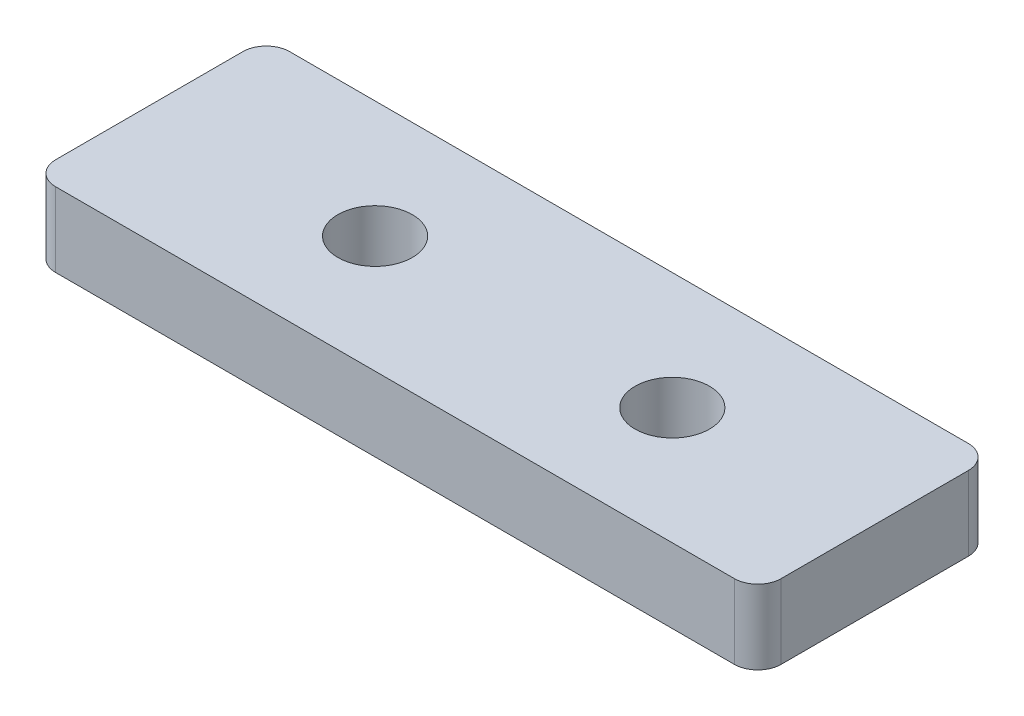
ISO-10303-21;
HEADER;
FILE_DESCRIPTION(('STEP AP214'),'2;1');
FILE_NAME('part.step','',(''),(''),'','','');
FILE_SCHEMA(('AUTOMOTIVE_DESIGN { 1 0 10303 214 1 1 1 1 }'));
ENDSEC;
DATA;
#1=APPLICATION_CONTEXT('core data for automotive mechanical design processes');
#2=APPLICATION_PROTOCOL_DEFINITION('international standard','automotive_design',2000,#1);
#3=PRODUCT_CONTEXT('',#1,'mechanical');
#4=PRODUCT('Part','Part','',(#3));
#5=PRODUCT_RELATED_PRODUCT_CATEGORY('part','',(#4));
#6=PRODUCT_DEFINITION_FORMATION('','',#4);
#7=PRODUCT_DEFINITION_CONTEXT('part definition',#1,'design');
#8=PRODUCT_DEFINITION('design','',#6,#7);
#9=PRODUCT_DEFINITION_SHAPE('','',#8);
#10=(LENGTH_UNIT() NAMED_UNIT(*) SI_UNIT(.MILLI.,.METRE.));
#11=(NAMED_UNIT(*) PLANE_ANGLE_UNIT() SI_UNIT($,.RADIAN.));
#12=(NAMED_UNIT(*) SI_UNIT($,.STERADIAN.) SOLID_ANGLE_UNIT());
#13=UNCERTAINTY_MEASURE_WITH_UNIT(LENGTH_MEASURE(1.E-05),#10,'distance_accuracy_value','');
#14=(GEOMETRIC_REPRESENTATION_CONTEXT(3) GLOBAL_UNCERTAINTY_ASSIGNED_CONTEXT((#13)) GLOBAL_UNIT_ASSIGNED_CONTEXT((#10,
#11,#12)) REPRESENTATION_CONTEXT('',''));
#15=CARTESIAN_POINT('',(0.,0.,0.));
#16=DIRECTION('',(0.,0.,1.));
#17=DIRECTION('',(1.,0.,0.));
#18=AXIS2_PLACEMENT_3D('',#15,#16,#17);
#19=CARTESIAN_POINT('',(0.,3.175,5.));
#20=DIRECTION('',(0.,0.,-1.));
#21=DIRECTION('',(-1.,0.,0.));
#22=AXIS2_PLACEMENT_3D('',#19,#20,#21);
#23=PLANE('',#22);
#24=DIRECTION('',(1.,0.,0.));
#25=VECTOR('',#24,1.);
#26=CARTESIAN_POINT('',(0.,0.,5.));
#27=LINE('',#26,#25);
#28=CARTESIAN_POINT('',(-8.65,0.,5.));
#29=VERTEX_POINT('',#28);
#30=CARTESIAN_POINT('',(20.35,0.,5.));
#31=VERTEX_POINT('',#30);
#32=EDGE_CURVE('E134',#29,#31,#27,.T.);
#33=ORIENTED_EDGE('',*,*,#32,.T.);
#34=DIRECTION('',(0.,-1.,0.));
#35=VECTOR('',#34,1.);
#36=CARTESIAN_POINT('',(20.35,3.175,5.));
#37=LINE('',#36,#35);
#38=CARTESIAN_POINT('',(20.35,3.175,5.));
#39=VERTEX_POINT('',#38);
#40=EDGE_CURVE('E162',#31,#39,#37,.F.);
#41=ORIENTED_EDGE('',*,*,#40,.T.);
#42=DIRECTION('',(1.,0.,0.));
#43=VECTOR('',#42,1.);
#44=CARTESIAN_POINT('',(0.,3.175,5.));
#45=LINE('',#44,#43);
#46=CARTESIAN_POINT('',(-8.65,3.175,5.));
#47=VERTEX_POINT('',#46);
#48=EDGE_CURVE('E212',#47,#39,#45,.T.);
#49=ORIENTED_EDGE('',*,*,#48,.F.);
#50=DIRECTION('',(0.,-1.,0.));
#51=VECTOR('',#50,1.);
#52=CARTESIAN_POINT('',(-8.65,3.175,5.));
#53=LINE('',#52,#51);
#54=EDGE_CURVE('E158',#47,#29,#53,.T.);
#55=ORIENTED_EDGE('',*,*,#54,.T.);
#56=EDGE_LOOP('',(#33,#41,#49,#55));
#57=FACE_BOUND('',#56,.T.);
#58=ADVANCED_FACE('F45',(#57),#23,.F.);
#59=CARTESIAN_POINT('',(21.35,3.175,0.));
#60=DIRECTION('',(1.,0.,0.));
#61=DIRECTION('',(0.,0.,-1.));
#62=AXIS2_PLACEMENT_3D('',#59,#60,#61);
#63=PLANE('',#62);
#64=DIRECTION('',(0.,0.,1.));
#65=VECTOR('',#64,1.);
#66=CARTESIAN_POINT('',(21.35,3.175,0.));
#67=LINE('',#66,#65);
#68=CARTESIAN_POINT('',(21.35,3.175,-4.));
#69=VERTEX_POINT('',#68);
#70=CARTESIAN_POINT('',(21.35,3.175,4.));
#71=VERTEX_POINT('',#70);
#72=EDGE_CURVE('E209',#69,#71,#67,.T.);
#73=ORIENTED_EDGE('',*,*,#72,.T.);
#74=DIRECTION('',(0.,-1.,0.));
#75=VECTOR('',#74,1.);
#76=CARTESIAN_POINT('',(21.35,0.,4.));
#77=LINE('',#76,#75);
#78=CARTESIAN_POINT('',(21.35,0.,4.));
#79=VERTEX_POINT('',#78);
#80=EDGE_CURVE('E132',#71,#79,#77,.T.);
#81=ORIENTED_EDGE('',*,*,#80,.T.);
#82=DIRECTION('',(0.,0.,1.));
#83=VECTOR('',#82,1.);
#84=CARTESIAN_POINT('',(21.35,0.,0.));
#85=LINE('',#84,#83);
#86=CARTESIAN_POINT('',(21.35,0.,-4.));
#87=VERTEX_POINT('',#86);
#88=EDGE_CURVE('E114',#87,#79,#85,.T.);
#89=ORIENTED_EDGE('',*,*,#88,.F.);
#90=DIRECTION('',(0.,-1.,0.));
#91=VECTOR('',#90,1.);
#92=CARTESIAN_POINT('',(21.35,3.175,-4.));
#93=LINE('',#92,#91);
#94=EDGE_CURVE('E129',#87,#69,#93,.F.);
#95=ORIENTED_EDGE('',*,*,#94,.T.);
#96=EDGE_LOOP('',(#73,#81,#89,#95));
#97=FACE_BOUND('',#96,.T.);
#98=ADVANCED_FACE('F128',(#97),#63,.T.);
#99=CARTESIAN_POINT('',(0.,3.175,-5.));
#100=DIRECTION('',(0.,0.,-1.));
#101=DIRECTION('',(-1.,0.,0.));
#102=AXIS2_PLACEMENT_3D('',#99,#100,#101);
#103=PLANE('',#102);
#104=DIRECTION('',(1.,0.,0.));
#105=VECTOR('',#104,1.);
#106=CARTESIAN_POINT('',(0.,3.175,-5.));
#107=LINE('',#106,#105);
#108=CARTESIAN_POINT('',(-8.65,3.175,-5.));
#109=VERTEX_POINT('',#108);
#110=CARTESIAN_POINT('',(20.35,3.175,-5.));
#111=VERTEX_POINT('',#110);
#112=EDGE_CURVE('E146',#109,#111,#107,.T.);
#113=ORIENTED_EDGE('',*,*,#112,.T.);
#114=DIRECTION('',(0.,-1.,0.));
#115=VECTOR('',#114,1.);
#116=CARTESIAN_POINT('',(20.35,3.175,-5.));
#117=LINE('',#116,#115);
#118=CARTESIAN_POINT('',(20.35,0.,-5.));
#119=VERTEX_POINT('',#118);
#120=EDGE_CURVE('E178',#111,#119,#117,.T.);
#121=ORIENTED_EDGE('',*,*,#120,.T.);
#122=DIRECTION('',(1.,0.,0.));
#123=VECTOR('',#122,1.);
#124=CARTESIAN_POINT('',(0.,0.,-5.));
#125=LINE('',#124,#123);
#126=CARTESIAN_POINT('',(-8.65,0.,-5.));
#127=VERTEX_POINT('',#126);
#128=EDGE_CURVE('E116',#127,#119,#125,.T.);
#129=ORIENTED_EDGE('',*,*,#128,.F.);
#130=DIRECTION('',(0.,-1.,0.));
#131=VECTOR('',#130,1.);
#132=CARTESIAN_POINT('',(-8.65,3.175,-5.));
#133=LINE('',#132,#131);
#134=EDGE_CURVE('E175',#127,#109,#133,.F.);
#135=ORIENTED_EDGE('',*,*,#134,.T.);
#136=EDGE_LOOP('',(#113,#121,#129,#135));
#137=FACE_BOUND('',#136,.T.);
#138=ADVANCED_FACE('F248',(#137),#103,.T.);
#139=CARTESIAN_POINT('',(0.,3.175,0.));
#140=DIRECTION('',(0.,-1.,0.));
#141=DIRECTION('',(0.,0.,-1.));
#142=AXIS2_PLACEMENT_3D('',#139,#140,#141);
#143=CYLINDRICAL_SURFACE('',#142,1.59);
#144=CARTESIAN_POINT('',(0.,3.175,0.));
#145=DIRECTION('',(0.,1.,0.));
#146=DIRECTION('',(0.,0.,1.));
#147=AXIS2_PLACEMENT_3D('',#144,#145,#146);
#148=CIRCLE('',#147,1.59);
#149=CARTESIAN_POINT('',(0.,3.175,1.59));
#150=VERTEX_POINT('',#149);
#151=EDGE_CURVE('E192',#150,#150,#148,.T.);
#152=ORIENTED_EDGE('',*,*,#151,.T.);
#153=EDGE_LOOP('',(#152));
#154=FACE_BOUND('',#153,.T.);
#155=CARTESIAN_POINT('',(0.,0.,0.));
#156=DIRECTION('',(0.,1.,0.));
#157=DIRECTION('',(0.,0.,1.));
#158=AXIS2_PLACEMENT_3D('',#155,#156,#157);
#159=CIRCLE('',#158,1.59);
#160=CARTESIAN_POINT('',(0.,0.,1.59));
#161=VERTEX_POINT('',#160);
#162=EDGE_CURVE('E198',#161,#161,#159,.T.);
#163=ORIENTED_EDGE('',*,*,#162,.F.);
#164=EDGE_LOOP('',(#163));
#165=FACE_BOUND('',#164,.T.);
#166=ADVANCED_FACE('F220',(#154,#165),#143,.F.);
#167=CARTESIAN_POINT('',(12.7,3.175,0.));
#168=DIRECTION('',(0.,-1.,0.));
#169=DIRECTION('',(0.,0.,-1.));
#170=AXIS2_PLACEMENT_3D('',#167,#168,#169);
#171=CYLINDRICAL_SURFACE('',#170,1.59);
#172=CARTESIAN_POINT('',(12.7,3.175,0.));
#173=DIRECTION('',(0.,1.,0.));
#174=DIRECTION('',(0.,0.,1.));
#175=AXIS2_PLACEMENT_3D('',#172,#173,#174);
#176=CIRCLE('',#175,1.59);
#177=CARTESIAN_POINT('',(12.7,3.175,1.59));
#178=VERTEX_POINT('',#177);
#179=EDGE_CURVE('E188',#178,#178,#176,.T.);
#180=ORIENTED_EDGE('',*,*,#179,.T.);
#181=EDGE_LOOP('',(#180));
#182=FACE_BOUND('',#181,.T.);
#183=CARTESIAN_POINT('',(12.7,0.,0.));
#184=DIRECTION('',(0.,1.,0.));
#185=DIRECTION('',(0.,0.,1.));
#186=AXIS2_PLACEMENT_3D('',#183,#184,#185);
#187=CIRCLE('',#186,1.59);
#188=CARTESIAN_POINT('',(12.7,0.,1.59));
#189=VERTEX_POINT('',#188);
#190=EDGE_CURVE('E202',#189,#189,#187,.T.);
#191=ORIENTED_EDGE('',*,*,#190,.F.);
#192=EDGE_LOOP('',(#191));
#193=FACE_BOUND('',#192,.T.);
#194=ADVANCED_FACE('F254',(#182,#193),#171,.F.);
#195=CARTESIAN_POINT('',(-9.65,3.175,0.));
#196=DIRECTION('',(1.,0.,0.));
#197=DIRECTION('',(0.,0.,-1.));
#198=AXIS2_PLACEMENT_3D('',#195,#196,#197);
#199=PLANE('',#198);
#200=DIRECTION('',(0.,0.,1.));
#201=VECTOR('',#200,1.);
#202=CARTESIAN_POINT('',(-9.65,0.,0.));
#203=LINE('',#202,#201);
#204=CARTESIAN_POINT('',(-9.65,0.,-4.));
#205=VERTEX_POINT('',#204);
#206=CARTESIAN_POINT('',(-9.65,0.,4.));
#207=VERTEX_POINT('',#206);
#208=EDGE_CURVE('E149',#205,#207,#203,.T.);
#209=ORIENTED_EDGE('',*,*,#208,.T.);
#210=DIRECTION('',(0.,-1.,0.));
#211=VECTOR('',#210,1.);
#212=CARTESIAN_POINT('',(-9.65,3.175,4.));
#213=LINE('',#212,#211);
#214=CARTESIAN_POINT('',(-9.65,3.175,4.));
#215=VERTEX_POINT('',#214);
#216=EDGE_CURVE('E11',#207,#215,#213,.F.);
#217=ORIENTED_EDGE('',*,*,#216,.T.);
#218=DIRECTION('',(0.,0.,1.));
#219=VECTOR('',#218,1.);
#220=CARTESIAN_POINT('',(-9.65,3.175,0.));
#221=LINE('',#220,#219);
#222=CARTESIAN_POINT('',(-9.65,3.175,-4.));
#223=VERTEX_POINT('',#222);
#224=EDGE_CURVE('E140',#223,#215,#221,.T.);
#225=ORIENTED_EDGE('',*,*,#224,.F.);
#226=DIRECTION('',(0.,-1.,0.));
#227=VECTOR('',#226,1.);
#228=CARTESIAN_POINT('',(-9.65,0.,-4.));
#229=LINE('',#228,#227);
#230=EDGE_CURVE('E54',#223,#205,#229,.T.);
#231=ORIENTED_EDGE('',*,*,#230,.T.);
#232=EDGE_LOOP('',(#209,#217,#225,#231));
#233=FACE_BOUND('',#232,.T.);
#234=ADVANCED_FACE('F184',(#233),#199,.F.);
#235=CARTESIAN_POINT('',(0.,3.175,0.));
#236=DIRECTION('',(0.,1.,0.));
#237=DIRECTION('',(0.,0.,1.));
#238=AXIS2_PLACEMENT_3D('',#235,#236,#237);
#239=PLANE('',#238);
#240=ORIENTED_EDGE('',*,*,#179,.F.);
#241=EDGE_LOOP('',(#240));
#242=FACE_BOUND('',#241,.T.);
#243=ORIENTED_EDGE('',*,*,#151,.F.);
#244=EDGE_LOOP('',(#243));
#245=FACE_BOUND('',#244,.T.);
#246=ORIENTED_EDGE('',*,*,#48,.T.);
#247=CARTESIAN_POINT('',(20.35,3.175,4.));
#248=DIRECTION('',(0.,1.,0.));
#249=DIRECTION('',(0.,0.,1.));
#250=AXIS2_PLACEMENT_3D('',#247,#248,#249);
#251=CIRCLE('',#250,1.);
#252=EDGE_CURVE('E172',#39,#71,#251,.T.);
#253=ORIENTED_EDGE('',*,*,#252,.T.);
#254=ORIENTED_EDGE('',*,*,#72,.F.);
#255=CARTESIAN_POINT('',(20.35,3.175,-4.));
#256=DIRECTION('',(0.,1.,0.));
#257=DIRECTION('',(0.,0.,1.));
#258=AXIS2_PLACEMENT_3D('',#255,#256,#257);
#259=CIRCLE('',#258,1.);
#260=EDGE_CURVE('E138',#69,#111,#259,.T.);
#261=ORIENTED_EDGE('',*,*,#260,.T.);
#262=ORIENTED_EDGE('',*,*,#112,.F.);
#263=CARTESIAN_POINT('',(-8.65,3.175,-4.));
#264=DIRECTION('',(0.,1.,0.));
#265=DIRECTION('',(0.,0.,1.));
#266=AXIS2_PLACEMENT_3D('',#263,#264,#265);
#267=CIRCLE('',#266,1.);
#268=EDGE_CURVE('E66',#109,#223,#267,.T.);
#269=ORIENTED_EDGE('',*,*,#268,.T.);
#270=ORIENTED_EDGE('',*,*,#224,.T.);
#271=CARTESIAN_POINT('',(-8.65,3.175,4.));
#272=DIRECTION('',(0.,1.,0.));
#273=DIRECTION('',(0.,0.,1.));
#274=AXIS2_PLACEMENT_3D('',#271,#272,#273);
#275=CIRCLE('',#274,1.);
#276=EDGE_CURVE('E167',#215,#47,#275,.T.);
#277=ORIENTED_EDGE('',*,*,#276,.T.);
#278=EDGE_LOOP('',(#246,#253,#254,#261,#262,#269,#270,#277));
#279=FACE_BOUND('',#278,.T.);
#280=ADVANCED_FACE('F223',(#242,#245,#279),#239,.T.);
#281=CARTESIAN_POINT('',(0.,0.,0.));
#282=DIRECTION('',(0.,1.,0.));
#283=DIRECTION('',(0.,0.,1.));
#284=AXIS2_PLACEMENT_3D('',#281,#282,#283);
#285=PLANE('',#284);
#286=ORIENTED_EDGE('',*,*,#190,.T.);
#287=EDGE_LOOP('',(#286));
#288=FACE_BOUND('',#287,.T.);
#289=ORIENTED_EDGE('',*,*,#162,.T.);
#290=EDGE_LOOP('',(#289));
#291=FACE_BOUND('',#290,.T.);
#292=ORIENTED_EDGE('',*,*,#88,.T.);
#293=CARTESIAN_POINT('',(20.35,0.,4.));
#294=DIRECTION('',(0.,1.,0.));
#295=DIRECTION('',(0.,0.,1.));
#296=AXIS2_PLACEMENT_3D('',#293,#294,#295);
#297=CIRCLE('',#296,1.);
#298=EDGE_CURVE('E122',#79,#31,#297,.F.);
#299=ORIENTED_EDGE('',*,*,#298,.T.);
#300=ORIENTED_EDGE('',*,*,#32,.F.);
#301=CARTESIAN_POINT('',(-8.65,0.,4.));
#302=DIRECTION('',(0.,1.,0.));
#303=DIRECTION('',(0.,0.,1.));
#304=AXIS2_PLACEMENT_3D('',#301,#302,#303);
#305=CIRCLE('',#304,1.);
#306=EDGE_CURVE('E123',#29,#207,#305,.F.);
#307=ORIENTED_EDGE('',*,*,#306,.T.);
#308=ORIENTED_EDGE('',*,*,#208,.F.);
#309=CARTESIAN_POINT('',(-8.65,0.,-4.));
#310=DIRECTION('',(0.,1.,0.));
#311=DIRECTION('',(0.,0.,1.));
#312=AXIS2_PLACEMENT_3D('',#309,#310,#311);
#313=CIRCLE('',#312,1.);
#314=EDGE_CURVE('E144',#205,#127,#313,.F.);
#315=ORIENTED_EDGE('',*,*,#314,.T.);
#316=ORIENTED_EDGE('',*,*,#128,.T.);
#317=CARTESIAN_POINT('',(20.35,0.,-4.));
#318=DIRECTION('',(0.,1.,0.));
#319=DIRECTION('',(0.,0.,1.));
#320=AXIS2_PLACEMENT_3D('',#317,#318,#319);
#321=CIRCLE('',#320,1.);
#322=EDGE_CURVE('E111',#119,#87,#321,.F.);
#323=ORIENTED_EDGE('',*,*,#322,.T.);
#324=EDGE_LOOP('',(#292,#299,#300,#307,#308,#315,#316,#323));
#325=FACE_BOUND('',#324,.T.);
#326=ADVANCED_FACE('F113',(#288,#291,#325),#285,.F.);
#327=CARTESIAN_POINT('',(20.35,3.175,4.));
#328=DIRECTION('',(0.,1.,0.));
#329=DIRECTION('',(0.,0.,1.));
#330=AXIS2_PLACEMENT_3D('',#327,#328,#329);
#331=CYLINDRICAL_SURFACE('',#330,1.);
#332=ORIENTED_EDGE('',*,*,#252,.F.);
#333=ORIENTED_EDGE('',*,*,#40,.F.);
#334=ORIENTED_EDGE('',*,*,#298,.F.);
#335=ORIENTED_EDGE('',*,*,#80,.F.);
#336=EDGE_LOOP('',(#332,#333,#334,#335));
#337=FACE_BOUND('',#336,.T.);
#338=ADVANCED_FACE('F234',(#337),#331,.T.);
#339=CARTESIAN_POINT('',(20.35,3.175,-4.));
#340=DIRECTION('',(0.,-1.,0.));
#341=DIRECTION('',(0.,0.,-1.));
#342=AXIS2_PLACEMENT_3D('',#339,#340,#341);
#343=CYLINDRICAL_SURFACE('',#342,1.);
#344=ORIENTED_EDGE('',*,*,#260,.F.);
#345=ORIENTED_EDGE('',*,*,#94,.F.);
#346=ORIENTED_EDGE('',*,*,#322,.F.);
#347=ORIENTED_EDGE('',*,*,#120,.F.);
#348=EDGE_LOOP('',(#344,#345,#346,#347));
#349=FACE_BOUND('',#348,.T.);
#350=ADVANCED_FACE('F137',(#349),#343,.T.);
#351=CARTESIAN_POINT('',(-8.65,3.175,4.));
#352=DIRECTION('',(0.,-1.,0.));
#353=DIRECTION('',(0.,0.,-1.));
#354=AXIS2_PLACEMENT_3D('',#351,#352,#353);
#355=CYLINDRICAL_SURFACE('',#354,1.);
#356=ORIENTED_EDGE('',*,*,#276,.F.);
#357=ORIENTED_EDGE('',*,*,#216,.F.);
#358=ORIENTED_EDGE('',*,*,#306,.F.);
#359=ORIENTED_EDGE('',*,*,#54,.F.);
#360=EDGE_LOOP('',(#356,#357,#358,#359));
#361=FACE_BOUND('',#360,.T.);
#362=ADVANCED_FACE('F236',(#361),#355,.T.);
#363=CARTESIAN_POINT('',(-8.65,3.175,-4.));
#364=DIRECTION('',(0.,1.,0.));
#365=DIRECTION('',(0.,0.,1.));
#366=AXIS2_PLACEMENT_3D('',#363,#364,#365);
#367=CYLINDRICAL_SURFACE('',#366,1.);
#368=ORIENTED_EDGE('',*,*,#268,.F.);
#369=ORIENTED_EDGE('',*,*,#134,.F.);
#370=ORIENTED_EDGE('',*,*,#314,.F.);
#371=ORIENTED_EDGE('',*,*,#230,.F.);
#372=EDGE_LOOP('',(#368,#369,#370,#371));
#373=FACE_BOUND('',#372,.T.);
#374=ADVANCED_FACE('F47',(#373),#367,.T.);
#375=CLOSED_SHELL('',(#58,#98,#138,#166,#194,#234,#280,#326,#338,#350,#362,#374));
#376=MANIFOLD_SOLID_BREP('B2',#375);
#377=ADVANCED_BREP_SHAPE_REPRESENTATION('',(#18,#376),#14);
#378=SHAPE_DEFINITION_REPRESENTATION(#9,#377);
ENDSEC;
END-ISO-10303-21;
